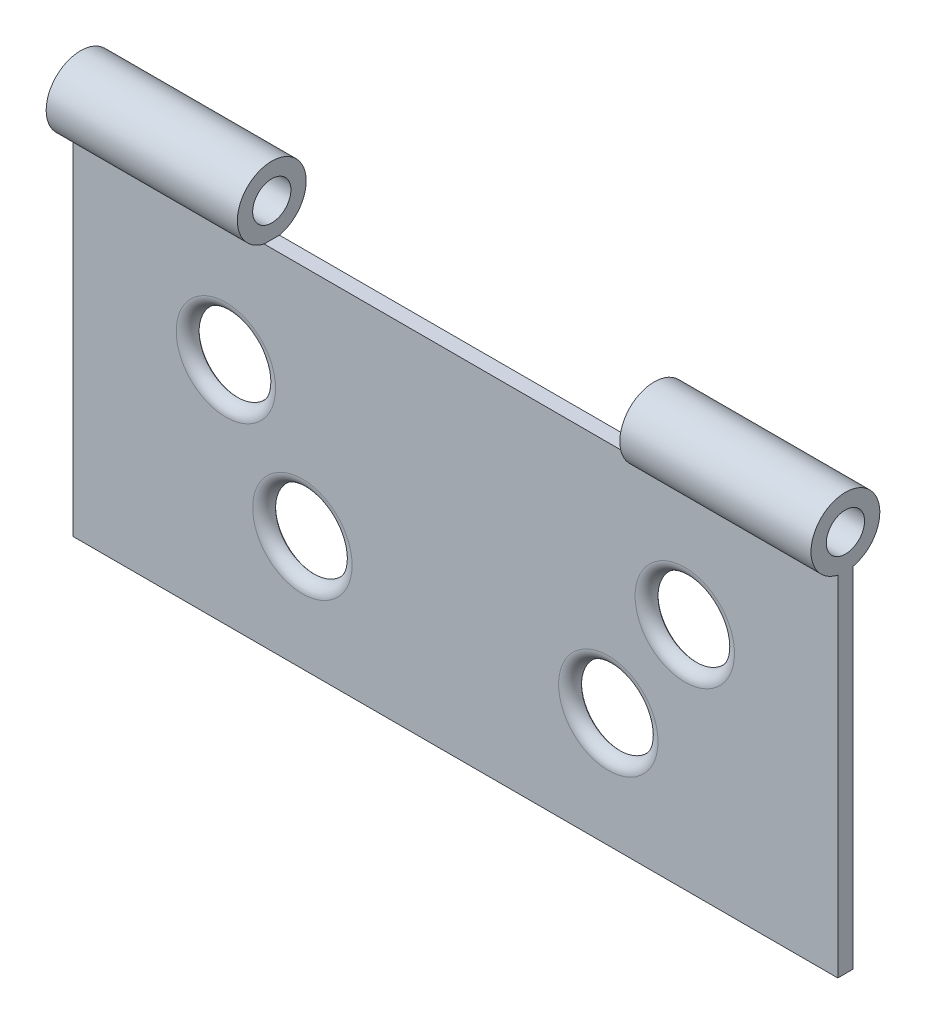
ISO-10303-21;
HEADER;
FILE_DESCRIPTION(('STEP AP214'),'2;1');
FILE_NAME('part.step','',(''),(''),'','','');
FILE_SCHEMA(('AUTOMOTIVE_DESIGN { 1 0 10303 214 1 1 1 1 }'));
ENDSEC;
DATA;
#1=APPLICATION_CONTEXT('core data for automotive mechanical design processes');
#2=APPLICATION_PROTOCOL_DEFINITION('international standard','automotive_design',2000,#1);
#3=PRODUCT_CONTEXT('',#1,'mechanical');
#4=PRODUCT('Part','Part','',(#3));
#5=PRODUCT_RELATED_PRODUCT_CATEGORY('part','',(#4));
#6=PRODUCT_DEFINITION_FORMATION('','',#4);
#7=PRODUCT_DEFINITION_CONTEXT('part definition',#1,'design');
#8=PRODUCT_DEFINITION('design','',#6,#7);
#9=PRODUCT_DEFINITION_SHAPE('','',#8);
#10=(LENGTH_UNIT() NAMED_UNIT(*) SI_UNIT(.MILLI.,.METRE.));
#11=(NAMED_UNIT(*) PLANE_ANGLE_UNIT() SI_UNIT($,.RADIAN.));
#12=(NAMED_UNIT(*) SI_UNIT($,.STERADIAN.) SOLID_ANGLE_UNIT());
#13=UNCERTAINTY_MEASURE_WITH_UNIT(LENGTH_MEASURE(1.E-05),#10,'distance_accuracy_value','');
#14=(GEOMETRIC_REPRESENTATION_CONTEXT(3) GLOBAL_UNCERTAINTY_ASSIGNED_CONTEXT((#13)) GLOBAL_UNIT_ASSIGNED_CONTEXT((#10,
#11,#12)) REPRESENTATION_CONTEXT('',''));
#15=CARTESIAN_POINT('',(0.,0.,0.));
#16=DIRECTION('',(0.,0.,1.));
#17=DIRECTION('',(1.,0.,0.));
#18=AXIS2_PLACEMENT_3D('',#15,#16,#17);
#19=CARTESIAN_POINT('',(-100.,0.,1.));
#20=DIRECTION('',(1.,0.,0.));
#21=DIRECTION('',(0.,0.,-1.));
#22=AXIS2_PLACEMENT_3D('',#19,#20,#21);
#23=CYLINDRICAL_SURFACE('',#22,4.5);
#24=DIRECTION('',(1.,0.,0.));
#25=VECTOR('',#24,1.);
#26=CARTESIAN_POINT('',(-100.,-4.38748219369606,2.));
#27=LINE('',#26,#25);
#28=CARTESIAN_POINT('',(-100.,-4.38748219369606,2.));
#29=VERTEX_POINT('',#28);
#30=CARTESIAN_POINT('',(-75.,-4.38748219369606,2.));
#31=VERTEX_POINT('',#30);
#32=EDGE_CURVE('E171',#29,#31,#27,.T.);
#33=ORIENTED_EDGE('',*,*,#32,.T.);
#34=CARTESIAN_POINT('',(-75.,0.,1.));
#35=DIRECTION('',(1.,0.,0.));
#36=DIRECTION('',(0.,0.,-1.));
#37=AXIS2_PLACEMENT_3D('',#34,#35,#36);
#38=CIRCLE('',#37,4.5);
#39=CARTESIAN_POINT('',(-75.,-4.38748219369606,0.));
#40=VERTEX_POINT('',#39);
#41=EDGE_CURVE('E114',#31,#40,#38,.F.);
#42=ORIENTED_EDGE('',*,*,#41,.T.);
#43=DIRECTION('',(1.,0.,0.));
#44=VECTOR('',#43,1.);
#45=CARTESIAN_POINT('',(-100.,-4.38748219369606,0.));
#46=LINE('',#45,#44);
#47=CARTESIAN_POINT('',(-100.,-4.38748219369606,0.));
#48=VERTEX_POINT('',#47);
#49=EDGE_CURVE('E14',#48,#40,#46,.T.);
#50=ORIENTED_EDGE('',*,*,#49,.F.);
#51=CARTESIAN_POINT('',(-100.,0.,1.));
#52=DIRECTION('',(1.,0.,0.));
#53=DIRECTION('',(0.,0.,-1.));
#54=AXIS2_PLACEMENT_3D('',#51,#52,#53);
#55=CIRCLE('',#54,4.5);
#56=EDGE_CURVE('E177',#48,#29,#55,.T.);
#57=ORIENTED_EDGE('',*,*,#56,.T.);
#58=EDGE_LOOP('',(#33,#42,#50,#57));
#59=FACE_BOUND('',#58,.T.);
#60=ADVANCED_FACE('F96',(#59),#23,.T.);
#61=CARTESIAN_POINT('',(-100.,0.,1.));
#62=DIRECTION('',(1.,0.,0.));
#63=DIRECTION('',(0.,0.,-1.));
#64=AXIS2_PLACEMENT_3D('',#61,#62,#63);
#65=CYLINDRICAL_SURFACE('',#64,2.5);
#66=CARTESIAN_POINT('',(-100.,0.,1.));
#67=DIRECTION('',(1.,0.,0.));
#68=DIRECTION('',(0.,0.,-1.));
#69=AXIS2_PLACEMENT_3D('',#66,#67,#68);
#70=CIRCLE('',#69,2.5);
#71=CARTESIAN_POINT('',(-100.,0.,-1.5));
#72=VERTEX_POINT('',#71);
#73=EDGE_CURVE('E188',#72,#72,#70,.T.);
#74=ORIENTED_EDGE('',*,*,#73,.F.);
#75=EDGE_LOOP('',(#74));
#76=FACE_BOUND('',#75,.T.);
#77=CARTESIAN_POINT('',(-75.,0.,1.));
#78=DIRECTION('',(1.,0.,0.));
#79=DIRECTION('',(0.,0.,-1.));
#80=AXIS2_PLACEMENT_3D('',#77,#78,#79);
#81=CIRCLE('',#80,2.5);
#82=CARTESIAN_POINT('',(-75.,0.,-1.5));
#83=VERTEX_POINT('',#82);
#84=EDGE_CURVE('E155',#83,#83,#81,.F.);
#85=ORIENTED_EDGE('',*,*,#84,.F.);
#86=EDGE_LOOP('',(#85));
#87=FACE_BOUND('',#86,.T.);
#88=ADVANCED_FACE('F282',(#76,#87),#65,.F.);
#89=CARTESIAN_POINT('',(-100.,0.,2.));
#90=DIRECTION('',(1.,0.,0.));
#91=DIRECTION('',(0.,0.,-1.));
#92=AXIS2_PLACEMENT_3D('',#89,#90,#91);
#93=PLANE('',#92);
#94=DIRECTION('',(0.,-1.,0.));
#95=VECTOR('',#94,1.);
#96=CARTESIAN_POINT('',(-100.,0.,2.));
#97=LINE('',#96,#95);
#98=CARTESIAN_POINT('',(-100.,-50.,2.));
#99=VERTEX_POINT('',#98);
#100=EDGE_CURVE('E246',#29,#99,#97,.T.);
#101=ORIENTED_EDGE('',*,*,#100,.F.);
#102=ORIENTED_EDGE('',*,*,#56,.F.);
#103=DIRECTION('',(0.,-1.,0.));
#104=VECTOR('',#103,1.);
#105=CARTESIAN_POINT('',(-100.,0.,0.));
#106=LINE('',#105,#104);
#107=CARTESIAN_POINT('',(-100.,-50.,0.));
#108=VERTEX_POINT('',#107);
#109=EDGE_CURVE('E121',#48,#108,#106,.T.);
#110=ORIENTED_EDGE('',*,*,#109,.T.);
#111=DIRECTION('',(0.,0.,-1.));
#112=VECTOR('',#111,1.);
#113=CARTESIAN_POINT('',(-100.,-50.,2.));
#114=LINE('',#113,#112);
#115=EDGE_CURVE('E237',#99,#108,#114,.T.);
#116=ORIENTED_EDGE('',*,*,#115,.F.);
#117=EDGE_LOOP('',(#101,#102,#110,#116));
#118=FACE_BOUND('',#117,.T.);
#119=ORIENTED_EDGE('',*,*,#73,.T.);
#120=EDGE_LOOP('',(#119));
#121=FACE_BOUND('',#120,.T.);
#122=ADVANCED_FACE('F254',(#118,#121),#93,.F.);
#123=CARTESIAN_POINT('',(0.,0.,2.));
#124=DIRECTION('',(1.,0.,0.));
#125=DIRECTION('',(0.,1.,0.));
#126=AXIS2_PLACEMENT_3D('',#123,#124,#125);
#127=PLANE('',#126);
#128=DIRECTION('',(0.,-1.,0.));
#129=VECTOR('',#128,1.);
#130=CARTESIAN_POINT('',(0.,0.,0.));
#131=LINE('',#130,#129);
#132=CARTESIAN_POINT('',(0.,-4.38748219369606,0.));
#133=VERTEX_POINT('',#132);
#134=CARTESIAN_POINT('',(0.,-50.,0.));
#135=VERTEX_POINT('',#134);
#136=EDGE_CURVE('E244',#133,#135,#131,.T.);
#137=ORIENTED_EDGE('',*,*,#136,.F.);
#138=CARTESIAN_POINT('',(0.,0.,1.));
#139=DIRECTION('',(1.,0.,0.));
#140=DIRECTION('',(0.,0.,-1.));
#141=AXIS2_PLACEMENT_3D('',#138,#139,#140);
#142=CIRCLE('',#141,4.5);
#143=CARTESIAN_POINT('',(0.,-4.38748219369606,2.));
#144=VERTEX_POINT('',#143);
#145=EDGE_CURVE('E186',#133,#144,#142,.T.);
#146=ORIENTED_EDGE('',*,*,#145,.T.);
#147=DIRECTION('',(0.,-1.,0.));
#148=VECTOR('',#147,1.);
#149=CARTESIAN_POINT('',(0.,0.,2.));
#150=LINE('',#149,#148);
#151=CARTESIAN_POINT('',(0.,-50.,2.));
#152=VERTEX_POINT('',#151);
#153=EDGE_CURVE('E243',#144,#152,#150,.T.);
#154=ORIENTED_EDGE('',*,*,#153,.T.);
#155=DIRECTION('',(0.,0.,-1.));
#156=VECTOR('',#155,1.);
#157=CARTESIAN_POINT('',(0.,-50.,2.));
#158=LINE('',#157,#156);
#159=EDGE_CURVE('E240',#152,#135,#158,.T.);
#160=ORIENTED_EDGE('',*,*,#159,.T.);
#161=EDGE_LOOP('',(#137,#146,#154,#160));
#162=FACE_BOUND('',#161,.T.);
#163=CARTESIAN_POINT('',(0.,0.,1.));
#164=DIRECTION('',(1.,0.,0.));
#165=DIRECTION('',(0.,0.,-1.));
#166=AXIS2_PLACEMENT_3D('',#163,#164,#165);
#167=CIRCLE('',#166,2.5);
#168=CARTESIAN_POINT('',(0.,0.,-1.5));
#169=VERTEX_POINT('',#168);
#170=EDGE_CURVE('E190',#169,#169,#167,.T.);
#171=ORIENTED_EDGE('',*,*,#170,.F.);
#172=EDGE_LOOP('',(#171));
#173=FACE_BOUND('',#172,.T.);
#174=ADVANCED_FACE('F262',(#162,#173),#127,.T.);
#175=CARTESIAN_POINT('',(0.,-50.,2.));
#176=DIRECTION('',(0.,-1.,0.));
#177=DIRECTION('',(1.,0.,0.));
#178=AXIS2_PLACEMENT_3D('',#175,#176,#177);
#179=PLANE('',#178);
#180=DIRECTION('',(-1.,0.,0.));
#181=VECTOR('',#180,1.);
#182=CARTESIAN_POINT('',(0.,-50.,0.));
#183=LINE('',#182,#181);
#184=EDGE_CURVE('E178',#135,#108,#183,.T.);
#185=ORIENTED_EDGE('',*,*,#184,.F.);
#186=ORIENTED_EDGE('',*,*,#159,.F.);
#187=DIRECTION('',(-1.,0.,0.));
#188=VECTOR('',#187,1.);
#189=CARTESIAN_POINT('',(0.,-50.,2.));
#190=LINE('',#189,#188);
#191=EDGE_CURVE('E249',#152,#99,#190,.T.);
#192=ORIENTED_EDGE('',*,*,#191,.T.);
#193=ORIENTED_EDGE('',*,*,#115,.T.);
#194=EDGE_LOOP('',(#185,#186,#192,#193));
#195=FACE_BOUND('',#194,.T.);
#196=ADVANCED_FACE('F259',(#195),#179,.T.);
#197=CARTESIAN_POINT('',(0.,0.,2.));
#198=DIRECTION('',(0.,0.,1.));
#199=DIRECTION('',(1.,0.,0.));
#200=AXIS2_PLACEMENT_3D('',#197,#198,#199);
#201=PLANE('',#200);
#202=ORIENTED_EDGE('',*,*,#32,.F.);
#203=ORIENTED_EDGE('',*,*,#100,.T.);
#204=ORIENTED_EDGE('',*,*,#191,.F.);
#205=ORIENTED_EDGE('',*,*,#153,.F.);
#206=CARTESIAN_POINT('',(-25.,-4.38748219369606,2.));
#207=VERTEX_POINT('',#206);
#208=EDGE_CURVE('E174',#207,#144,#27,.T.);
#209=ORIENTED_EDGE('',*,*,#208,.F.);
#210=EDGE_CURVE('E161',#31,#207,#27,.T.);
#211=ORIENTED_EDGE('',*,*,#210,.F.);
#212=EDGE_LOOP('',(#202,#203,#204,#205,#209,#211));
#213=FACE_BOUND('',#212,.T.);
#214=CARTESIAN_POINT('',(-20.,-20.,2.));
#215=DIRECTION('',(0.,0.,1.));
#216=DIRECTION('',(1.,0.,0.));
#217=AXIS2_PLACEMENT_3D('',#214,#215,#216);
#218=CIRCLE('',#217,6.5);
#219=CARTESIAN_POINT('',(-13.5,-20.,2.));
#220=VERTEX_POINT('',#219);
#221=EDGE_CURVE('E222',#220,#220,#218,.F.);
#222=ORIENTED_EDGE('',*,*,#221,.T.);
#223=EDGE_LOOP('',(#222));
#224=FACE_BOUND('',#223,.T.);
#225=CARTESIAN_POINT('',(-30.,-35.,2.));
#226=DIRECTION('',(0.,0.,1.));
#227=DIRECTION('',(1.,0.,0.));
#228=AXIS2_PLACEMENT_3D('',#225,#226,#227);
#229=CIRCLE('',#228,6.5);
#230=CARTESIAN_POINT('',(-23.5,-35.,2.));
#231=VERTEX_POINT('',#230);
#232=EDGE_CURVE('E225',#231,#231,#229,.F.);
#233=ORIENTED_EDGE('',*,*,#232,.T.);
#234=EDGE_LOOP('',(#233));
#235=FACE_BOUND('',#234,.T.);
#236=CARTESIAN_POINT('',(-70.,-35.,2.));
#237=DIRECTION('',(0.,0.,1.));
#238=DIRECTION('',(1.,0.,0.));
#239=AXIS2_PLACEMENT_3D('',#236,#237,#238);
#240=CIRCLE('',#239,6.50000000000001);
#241=CARTESIAN_POINT('',(-63.5,-35.,2.));
#242=VERTEX_POINT('',#241);
#243=EDGE_CURVE('E228',#242,#242,#240,.F.);
#244=ORIENTED_EDGE('',*,*,#243,.T.);
#245=EDGE_LOOP('',(#244));
#246=FACE_BOUND('',#245,.T.);
#247=CARTESIAN_POINT('',(-80.,-20.,2.));
#248=DIRECTION('',(0.,0.,1.));
#249=DIRECTION('',(1.,0.,0.));
#250=AXIS2_PLACEMENT_3D('',#247,#248,#249);
#251=CIRCLE('',#250,6.5);
#252=CARTESIAN_POINT('',(-73.5,-20.,2.));
#253=VERTEX_POINT('',#252);
#254=EDGE_CURVE('E231',#253,#253,#251,.F.);
#255=ORIENTED_EDGE('',*,*,#254,.T.);
#256=EDGE_LOOP('',(#255));
#257=FACE_BOUND('',#256,.T.);
#258=ADVANCED_FACE('F169',(#213,#224,#235,#246,#257),#201,.T.);
#259=CARTESIAN_POINT('',(0.,0.,0.));
#260=DIRECTION('',(0.,0.,1.));
#261=DIRECTION('',(1.,0.,0.));
#262=AXIS2_PLACEMENT_3D('',#259,#260,#261);
#263=PLANE('',#262);
#264=CARTESIAN_POINT('',(-70.,-35.,0.));
#265=DIRECTION('',(0.,0.,1.));
#266=DIRECTION('',(1.,0.,0.));
#267=AXIS2_PLACEMENT_3D('',#264,#265,#266);
#268=CIRCLE('',#267,6.1180339887499);
#269=CARTESIAN_POINT('',(-63.8819660112501,-35.,0.));
#270=VERTEX_POINT('',#269);
#271=EDGE_CURVE('E201',#270,#270,#268,.T.);
#272=ORIENTED_EDGE('',*,*,#271,.T.);
#273=EDGE_LOOP('',(#272));
#274=FACE_BOUND('',#273,.T.);
#275=CARTESIAN_POINT('',(-80.,-20.,0.));
#276=DIRECTION('',(0.,0.,1.));
#277=DIRECTION('',(1.,0.,0.));
#278=AXIS2_PLACEMENT_3D('',#275,#276,#277);
#279=CIRCLE('',#278,6.1180339887499);
#280=CARTESIAN_POINT('',(-73.8819660112501,-20.,0.));
#281=VERTEX_POINT('',#280);
#282=EDGE_CURVE('E204',#281,#281,#279,.T.);
#283=ORIENTED_EDGE('',*,*,#282,.T.);
#284=EDGE_LOOP('',(#283));
#285=FACE_BOUND('',#284,.T.);
#286=CARTESIAN_POINT('',(-30.,-35.,0.));
#287=DIRECTION('',(0.,0.,1.));
#288=DIRECTION('',(1.,0.,0.));
#289=AXIS2_PLACEMENT_3D('',#286,#287,#288);
#290=CIRCLE('',#289,6.11803398874989);
#291=CARTESIAN_POINT('',(-23.8819660112501,-35.,0.));
#292=VERTEX_POINT('',#291);
#293=EDGE_CURVE('E207',#292,#292,#290,.T.);
#294=ORIENTED_EDGE('',*,*,#293,.T.);
#295=EDGE_LOOP('',(#294));
#296=FACE_BOUND('',#295,.T.);
#297=CARTESIAN_POINT('',(-20.,-20.,0.));
#298=DIRECTION('',(0.,0.,1.));
#299=DIRECTION('',(1.,0.,0.));
#300=AXIS2_PLACEMENT_3D('',#297,#298,#299);
#301=CIRCLE('',#300,6.1180339887499);
#302=CARTESIAN_POINT('',(-13.8819660112501,-20.,0.));
#303=VERTEX_POINT('',#302);
#304=EDGE_CURVE('E210',#303,#303,#301,.T.);
#305=ORIENTED_EDGE('',*,*,#304,.T.);
#306=EDGE_LOOP('',(#305));
#307=FACE_BOUND('',#306,.T.);
#308=ORIENTED_EDGE('',*,*,#109,.F.);
#309=ORIENTED_EDGE('',*,*,#49,.T.);
#310=CARTESIAN_POINT('',(-25.,-4.38748219369606,0.));
#311=VERTEX_POINT('',#310);
#312=EDGE_CURVE('E105',#40,#311,#46,.T.);
#313=ORIENTED_EDGE('',*,*,#312,.T.);
#314=EDGE_CURVE('E107',#311,#133,#46,.T.);
#315=ORIENTED_EDGE('',*,*,#314,.T.);
#316=ORIENTED_EDGE('',*,*,#136,.T.);
#317=ORIENTED_EDGE('',*,*,#184,.T.);
#318=EDGE_LOOP('',(#308,#309,#313,#315,#316,#317));
#319=FACE_BOUND('',#318,.T.);
#320=ADVANCED_FACE('F266',(#274,#285,#296,#307,#319),#263,.F.);
#321=CARTESIAN_POINT('',(-20.,-20.,0.5));
#322=DIRECTION('',(0.,0.,1.));
#323=DIRECTION('',(1.,0.,0.));
#324=AXIS2_PLACEMENT_3D('',#321,#322,#323);
#325=TOROIDAL_SURFACE('',#324,6.5,1.5);
#326=ORIENTED_EDGE('',*,*,#221,.F.);
#327=EDGE_LOOP('',(#326));
#328=FACE_BOUND('',#327,.T.);
#329=CARTESIAN_POINT('',(-20.,-20.,0.5));
#330=DIRECTION('',(0.,0.,1.));
#331=DIRECTION('',(1.,0.,0.));
#332=AXIS2_PLACEMENT_3D('',#329,#330,#331);
#333=CIRCLE('',#332,5.);
#334=CARTESIAN_POINT('',(-15.,-20.,0.5));
#335=VERTEX_POINT('',#334);
#336=EDGE_CURVE('E234',#335,#335,#333,.T.);
#337=ORIENTED_EDGE('',*,*,#336,.F.);
#338=EDGE_LOOP('',(#337));
#339=FACE_BOUND('',#338,.T.);
#340=ADVANCED_FACE('F268',(#328,#339),#325,.T.);
#341=CARTESIAN_POINT('',(-30.,-35.,0.5));
#342=DIRECTION('',(0.,0.,1.));
#343=DIRECTION('',(1.,0.,0.));
#344=AXIS2_PLACEMENT_3D('',#341,#342,#343);
#345=TOROIDAL_SURFACE('',#344,6.5,1.5);
#346=ORIENTED_EDGE('',*,*,#232,.F.);
#347=EDGE_LOOP('',(#346));
#348=FACE_BOUND('',#347,.T.);
#349=CARTESIAN_POINT('',(-30.,-35.,0.5));
#350=DIRECTION('',(0.,0.,1.));
#351=DIRECTION('',(1.,0.,0.));
#352=AXIS2_PLACEMENT_3D('',#349,#350,#351);
#353=CIRCLE('',#352,5.);
#354=CARTESIAN_POINT('',(-25.,-35.,0.5));
#355=VERTEX_POINT('',#354);
#356=EDGE_CURVE('E219',#355,#355,#353,.T.);
#357=ORIENTED_EDGE('',*,*,#356,.F.);
#358=EDGE_LOOP('',(#357));
#359=FACE_BOUND('',#358,.T.);
#360=ADVANCED_FACE('F275',(#348,#359),#345,.T.);
#361=CARTESIAN_POINT('',(-70.,-35.,0.5));
#362=DIRECTION('',(0.,0.,1.));
#363=DIRECTION('',(1.,0.,0.));
#364=AXIS2_PLACEMENT_3D('',#361,#362,#363);
#365=TOROIDAL_SURFACE('',#364,6.50000000000001,1.5);
#366=ORIENTED_EDGE('',*,*,#243,.F.);
#367=EDGE_LOOP('',(#366));
#368=FACE_BOUND('',#367,.T.);
#369=CARTESIAN_POINT('',(-70.,-35.,0.5));
#370=DIRECTION('',(0.,0.,1.));
#371=DIRECTION('',(1.,0.,0.));
#372=AXIS2_PLACEMENT_3D('',#369,#370,#371);
#373=CIRCLE('',#372,5.00000000000001);
#374=CARTESIAN_POINT('',(-65.,-35.,0.5));
#375=VERTEX_POINT('',#374);
#376=EDGE_CURVE('E216',#375,#375,#373,.T.);
#377=ORIENTED_EDGE('',*,*,#376,.F.);
#378=EDGE_LOOP('',(#377));
#379=FACE_BOUND('',#378,.T.);
#380=ADVANCED_FACE('F323',(#368,#379),#365,.T.);
#381=CARTESIAN_POINT('',(-80.,-20.,0.5));
#382=DIRECTION('',(0.,0.,1.));
#383=DIRECTION('',(1.,0.,0.));
#384=AXIS2_PLACEMENT_3D('',#381,#382,#383);
#385=TOROIDAL_SURFACE('',#384,6.5,1.5);
#386=ORIENTED_EDGE('',*,*,#254,.F.);
#387=EDGE_LOOP('',(#386));
#388=FACE_BOUND('',#387,.T.);
#389=CARTESIAN_POINT('',(-80.,-20.,0.5));
#390=DIRECTION('',(0.,0.,1.));
#391=DIRECTION('',(1.,0.,0.));
#392=AXIS2_PLACEMENT_3D('',#389,#390,#391);
#393=CIRCLE('',#392,5.);
#394=CARTESIAN_POINT('',(-75.,-20.,0.5));
#395=VERTEX_POINT('',#394);
#396=EDGE_CURVE('E213',#395,#395,#393,.T.);
#397=ORIENTED_EDGE('',*,*,#396,.F.);
#398=EDGE_LOOP('',(#397));
#399=FACE_BOUND('',#398,.T.);
#400=ADVANCED_FACE('F319',(#388,#399),#385,.T.);
#401=CARTESIAN_POINT('',(-70.,-35.,1.5));
#402=DIRECTION('',(0.,0.,1.));
#403=DIRECTION('',(1.,0.,0.));
#404=AXIS2_PLACEMENT_3D('',#401,#402,#403);
#405=TOROIDAL_SURFACE('',#404,6.1180339887499,1.5);
#406=ORIENTED_EDGE('',*,*,#376,.T.);
#407=EDGE_LOOP('',(#406));
#408=FACE_BOUND('',#407,.T.);
#409=ORIENTED_EDGE('',*,*,#271,.F.);
#410=EDGE_LOOP('',(#409));
#411=FACE_BOUND('',#410,.T.);
#412=ADVANCED_FACE('F312',(#408,#411),#405,.T.);
#413=CARTESIAN_POINT('',(-80.,-20.,1.5));
#414=DIRECTION('',(0.,0.,1.));
#415=DIRECTION('',(1.,0.,0.));
#416=AXIS2_PLACEMENT_3D('',#413,#414,#415);
#417=TOROIDAL_SURFACE('',#416,6.1180339887499,1.5);
#418=ORIENTED_EDGE('',*,*,#396,.T.);
#419=EDGE_LOOP('',(#418));
#420=FACE_BOUND('',#419,.T.);
#421=ORIENTED_EDGE('',*,*,#282,.F.);
#422=EDGE_LOOP('',(#421));
#423=FACE_BOUND('',#422,.T.);
#424=ADVANCED_FACE('F302',(#420,#423),#417,.T.);
#425=CARTESIAN_POINT('',(-30.,-35.,1.5));
#426=DIRECTION('',(0.,0.,1.));
#427=DIRECTION('',(1.,0.,0.));
#428=AXIS2_PLACEMENT_3D('',#425,#426,#427);
#429=TOROIDAL_SURFACE('',#428,6.11803398874989,1.5);
#430=ORIENTED_EDGE('',*,*,#356,.T.);
#431=EDGE_LOOP('',(#430));
#432=FACE_BOUND('',#431,.T.);
#433=ORIENTED_EDGE('',*,*,#293,.F.);
#434=EDGE_LOOP('',(#433));
#435=FACE_BOUND('',#434,.T.);
#436=ADVANCED_FACE('F297',(#432,#435),#429,.T.);
#437=CARTESIAN_POINT('',(-20.,-20.,1.5));
#438=DIRECTION('',(0.,0.,1.));
#439=DIRECTION('',(1.,0.,0.));
#440=AXIS2_PLACEMENT_3D('',#437,#438,#439);
#441=TOROIDAL_SURFACE('',#440,6.1180339887499,1.5);
#442=ORIENTED_EDGE('',*,*,#336,.T.);
#443=EDGE_LOOP('',(#442));
#444=FACE_BOUND('',#443,.T.);
#445=ORIENTED_EDGE('',*,*,#304,.F.);
#446=EDGE_LOOP('',(#445));
#447=FACE_BOUND('',#446,.T.);
#448=ADVANCED_FACE('F98',(#444,#447),#441,.T.);
#449=CARTESIAN_POINT('',(-25.,0.,1.));
#450=DIRECTION('',(1.,0.,0.));
#451=DIRECTION('',(0.,0.,-1.));
#452=AXIS2_PLACEMENT_3D('',#449,#450,#451);
#453=CIRCLE('',#452,4.5);
#454=EDGE_CURVE('E193',#207,#311,#453,.F.);
#455=ORIENTED_EDGE('',*,*,#454,.F.);
#456=ORIENTED_EDGE('',*,*,#208,.T.);
#457=ORIENTED_EDGE('',*,*,#145,.F.);
#458=ORIENTED_EDGE('',*,*,#314,.F.);
#459=EDGE_LOOP('',(#455,#456,#457,#458));
#460=FACE_BOUND('',#459,.T.);
#461=ADVANCED_FACE('F265',(#460),#23,.T.);
#462=CARTESIAN_POINT('',(-25.,0.,1.));
#463=DIRECTION('',(1.,0.,0.));
#464=DIRECTION('',(0.,0.,-1.));
#465=AXIS2_PLACEMENT_3D('',#462,#463,#464);
#466=CIRCLE('',#465,2.5);
#467=CARTESIAN_POINT('',(-25.,0.,-1.5));
#468=VERTEX_POINT('',#467);
#469=EDGE_CURVE('E100',#468,#468,#466,.F.);
#470=ORIENTED_EDGE('',*,*,#469,.T.);
#471=EDGE_LOOP('',(#470));
#472=FACE_BOUND('',#471,.T.);
#473=ORIENTED_EDGE('',*,*,#170,.T.);
#474=EDGE_LOOP('',(#473));
#475=FACE_BOUND('',#474,.T.);
#476=ADVANCED_FACE('F289',(#472,#475),#65,.F.);
#477=CARTESIAN_POINT('',(-25.,0.,-10.));
#478=DIRECTION('',(1.,0.,0.));
#479=DIRECTION('',(0.,0.,-1.));
#480=AXIS2_PLACEMENT_3D('',#477,#478,#479);
#481=PLANE('',#480);
#482=ORIENTED_EDGE('',*,*,#454,.T.);
#483=DIRECTION('',(0.,0.,1.));
#484=VECTOR('',#483,1.);
#485=CARTESIAN_POINT('',(-25.,-4.38748219369606,-10.));
#486=LINE('',#485,#484);
#487=EDGE_CURVE('E164',#311,#207,#486,.T.);
#488=ORIENTED_EDGE('',*,*,#487,.T.);
#489=EDGE_LOOP('',(#482,#488));
#490=FACE_BOUND('',#489,.T.);
#491=ORIENTED_EDGE('',*,*,#469,.F.);
#492=EDGE_LOOP('',(#491));
#493=FACE_BOUND('',#492,.T.);
#494=ADVANCED_FACE('F295',(#490,#493),#481,.F.);
#495=CARTESIAN_POINT('',(-75.,0.,-10.));
#496=DIRECTION('',(1.,0.,0.));
#497=DIRECTION('',(0.,0.,-1.));
#498=AXIS2_PLACEMENT_3D('',#495,#496,#497);
#499=PLANE('',#498);
#500=DIRECTION('',(0.,0.,1.));
#501=VECTOR('',#500,1.);
#502=CARTESIAN_POINT('',(-75.,-4.38748219369606,-10.));
#503=LINE('',#502,#501);
#504=EDGE_CURVE('E153',#40,#31,#503,.T.);
#505=ORIENTED_EDGE('',*,*,#504,.F.);
#506=ORIENTED_EDGE('',*,*,#41,.F.);
#507=EDGE_LOOP('',(#505,#506));
#508=FACE_BOUND('',#507,.T.);
#509=ORIENTED_EDGE('',*,*,#84,.T.);
#510=EDGE_LOOP('',(#509));
#511=FACE_BOUND('',#510,.T.);
#512=ADVANCED_FACE('F151',(#508,#511),#499,.T.);
#513=CARTESIAN_POINT('',(0.,-4.38748219369606,-10.));
#514=DIRECTION('',(0.,-1.,0.));
#515=DIRECTION('',(0.,0.,-1.));
#516=AXIS2_PLACEMENT_3D('',#513,#514,#515);
#517=PLANE('',#516);
#518=ORIENTED_EDGE('',*,*,#312,.F.);
#519=ORIENTED_EDGE('',*,*,#504,.T.);
#520=ORIENTED_EDGE('',*,*,#210,.T.);
#521=ORIENTED_EDGE('',*,*,#487,.F.);
#522=EDGE_LOOP('',(#518,#519,#520,#521));
#523=FACE_BOUND('',#522,.T.);
#524=ADVANCED_FACE('F159',(#523),#517,.F.);
#525=CLOSED_SHELL('',(#60,#88,#122,#174,#196,#258,#320,#340,#360,#380,#400,#412,#424,#436,#448,
#461,#476,#494,#512,#524));
#526=MANIFOLD_SOLID_BREP('B2',#525);
#527=ADVANCED_BREP_SHAPE_REPRESENTATION('',(#18,#526),#14);
#528=SHAPE_DEFINITION_REPRESENTATION(#9,#527);
ENDSEC;
END-ISO-10303-21;
